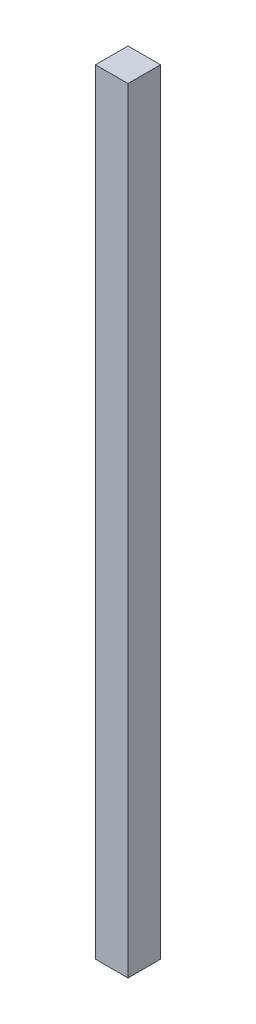
ISO-10303-21;
HEADER;
FILE_DESCRIPTION(('STEP AP214'),'2;1');
FILE_NAME('part.step','',(''),(''),'','','');
FILE_SCHEMA(('AUTOMOTIVE_DESIGN { 1 0 10303 214 1 1 1 1 }'));
ENDSEC;
DATA;
#1=APPLICATION_CONTEXT('core data for automotive mechanical design processes');
#2=APPLICATION_PROTOCOL_DEFINITION('international standard','automotive_design',2000,#1);
#3=PRODUCT_CONTEXT('',#1,'mechanical');
#4=PRODUCT('Part','Part','',(#3));
#5=PRODUCT_RELATED_PRODUCT_CATEGORY('part','',(#4));
#6=PRODUCT_DEFINITION_FORMATION('','',#4);
#7=PRODUCT_DEFINITION_CONTEXT('part definition',#1,'design');
#8=PRODUCT_DEFINITION('design','',#6,#7);
#9=PRODUCT_DEFINITION_SHAPE('','',#8);
#10=(LENGTH_UNIT() NAMED_UNIT(*) SI_UNIT(.MILLI.,.METRE.));
#11=(NAMED_UNIT(*) PLANE_ANGLE_UNIT() SI_UNIT($,.RADIAN.));
#12=(NAMED_UNIT(*) SI_UNIT($,.STERADIAN.) SOLID_ANGLE_UNIT());
#13=UNCERTAINTY_MEASURE_WITH_UNIT(LENGTH_MEASURE(1.E-05),#10,'distance_accuracy_value','');
#14=(GEOMETRIC_REPRESENTATION_CONTEXT(3) GLOBAL_UNCERTAINTY_ASSIGNED_CONTEXT((#13)) GLOBAL_UNIT_ASSIGNED_CONTEXT((#10,
#11,#12)) REPRESENTATION_CONTEXT('',''));
#15=CARTESIAN_POINT('',(0.,0.,0.));
#16=DIRECTION('',(0.,0.,1.));
#17=DIRECTION('',(1.,0.,0.));
#18=AXIS2_PLACEMENT_3D('',#15,#16,#17);
#19=CARTESIAN_POINT('',(5.244044241,250.,-5.24404424));
#20=DIRECTION('',(-1.,0.,0.));
#21=DIRECTION('',(0.,0.,1.));
#22=AXIS2_PLACEMENT_3D('',#19,#20,#21);
#23=PLANE('',#22);
#24=DIRECTION('',(0.,0.,-1.));
#25=VECTOR('',#24,1.);
#26=CARTESIAN_POINT('',(5.244044241,0.,-5.24404424));
#27=LINE('',#26,#25);
#28=CARTESIAN_POINT('',(5.244044241,0.,5.24404424));
#29=VERTEX_POINT('',#28);
#30=CARTESIAN_POINT('',(5.244044241,0.,-5.24404424));
#31=VERTEX_POINT('',#30);
#32=EDGE_CURVE('E113',#29,#31,#27,.T.);
#33=ORIENTED_EDGE('',*,*,#32,.T.);
#34=DIRECTION('',(0.,-1.,0.));
#35=VECTOR('',#34,1.);
#36=CARTESIAN_POINT('',(5.244044241,250.,-5.24404424));
#37=LINE('',#36,#35);
#38=CARTESIAN_POINT('',(5.244044241,250.,-5.24404424));
#39=VERTEX_POINT('',#38);
#40=EDGE_CURVE('E11',#39,#31,#37,.T.);
#41=ORIENTED_EDGE('',*,*,#40,.F.);
#42=DIRECTION('',(0.,0.,-1.));
#43=VECTOR('',#42,1.);
#44=CARTESIAN_POINT('',(5.244044241,250.,-5.24404424));
#45=LINE('',#44,#43);
#46=CARTESIAN_POINT('',(5.244044241,250.,5.24404424));
#47=VERTEX_POINT('',#46);
#48=EDGE_CURVE('E97',#47,#39,#45,.T.);
#49=ORIENTED_EDGE('',*,*,#48,.F.);
#50=DIRECTION('',(0.,-1.,0.));
#51=VECTOR('',#50,1.);
#52=CARTESIAN_POINT('',(5.244044241,250.,5.24404424));
#53=LINE('',#52,#51);
#54=EDGE_CURVE('E109',#47,#29,#53,.T.);
#55=ORIENTED_EDGE('',*,*,#54,.T.);
#56=EDGE_LOOP('',(#33,#41,#49,#55));
#57=FACE_BOUND('',#56,.T.);
#58=ADVANCED_FACE('F45',(#57),#23,.F.);
#59=CARTESIAN_POINT('',(-5.244044241,250.,-5.24404424));
#60=DIRECTION('',(0.,0.,1.));
#61=DIRECTION('',(1.,0.,0.));
#62=AXIS2_PLACEMENT_3D('',#59,#60,#61);
#63=PLANE('',#62);
#64=DIRECTION('',(-1.,0.,0.));
#65=VECTOR('',#64,1.);
#66=CARTESIAN_POINT('',(-5.244044241,0.,-5.24404424));
#67=LINE('',#66,#65);
#68=CARTESIAN_POINT('',(-5.244044241,0.,-5.24404424));
#69=VERTEX_POINT('',#68);
#70=EDGE_CURVE('E102',#31,#69,#67,.T.);
#71=ORIENTED_EDGE('',*,*,#70,.T.);
#72=DIRECTION('',(0.,-1.,0.));
#73=VECTOR('',#72,1.);
#74=CARTESIAN_POINT('',(-5.244044241,250.,-5.24404424));
#75=LINE('',#74,#73);
#76=CARTESIAN_POINT('',(-5.244044241,250.,-5.24404424));
#77=VERTEX_POINT('',#76);
#78=EDGE_CURVE('E54',#77,#69,#75,.T.);
#79=ORIENTED_EDGE('',*,*,#78,.F.);
#80=DIRECTION('',(-1.,0.,0.));
#81=VECTOR('',#80,1.);
#82=CARTESIAN_POINT('',(-5.244044241,250.,-5.24404424));
#83=LINE('',#82,#81);
#84=EDGE_CURVE('E92',#39,#77,#83,.T.);
#85=ORIENTED_EDGE('',*,*,#84,.F.);
#86=ORIENTED_EDGE('',*,*,#40,.T.);
#87=EDGE_LOOP('',(#71,#79,#85,#86));
#88=FACE_BOUND('',#87,.T.);
#89=ADVANCED_FACE('F101',(#88),#63,.F.);
#90=CARTESIAN_POINT('',(-5.244044241,250.,-5.24404424));
#91=DIRECTION('',(1.,0.,0.));
#92=DIRECTION('',(0.,0.,-1.));
#93=AXIS2_PLACEMENT_3D('',#90,#91,#92);
#94=PLANE('',#93);
#95=DIRECTION('',(0.,0.,1.));
#96=VECTOR('',#95,1.);
#97=CARTESIAN_POINT('',(-5.244044241,0.,-5.24404424));
#98=LINE('',#97,#96);
#99=CARTESIAN_POINT('',(-5.244044241,0.,5.24404424));
#100=VERTEX_POINT('',#99);
#101=EDGE_CURVE('E79',#69,#100,#98,.T.);
#102=ORIENTED_EDGE('',*,*,#101,.T.);
#103=DIRECTION('',(0.,-1.,0.));
#104=VECTOR('',#103,1.);
#105=CARTESIAN_POINT('',(-5.244044241,250.,5.24404424));
#106=LINE('',#105,#104);
#107=CARTESIAN_POINT('',(-5.244044241,250.,5.24404424));
#108=VERTEX_POINT('',#107);
#109=EDGE_CURVE('E104',#108,#100,#106,.T.);
#110=ORIENTED_EDGE('',*,*,#109,.F.);
#111=DIRECTION('',(0.,0.,1.));
#112=VECTOR('',#111,1.);
#113=CARTESIAN_POINT('',(-5.244044241,250.,-5.24404424));
#114=LINE('',#113,#112);
#115=EDGE_CURVE('E95',#77,#108,#114,.T.);
#116=ORIENTED_EDGE('',*,*,#115,.F.);
#117=ORIENTED_EDGE('',*,*,#78,.T.);
#118=EDGE_LOOP('',(#102,#110,#116,#117));
#119=FACE_BOUND('',#118,.T.);
#120=ADVANCED_FACE('F105',(#119),#94,.F.);
#121=CARTESIAN_POINT('',(-5.244044241,250.,5.24404424));
#122=DIRECTION('',(0.,0.,-1.));
#123=DIRECTION('',(-1.,0.,0.));
#124=AXIS2_PLACEMENT_3D('',#121,#122,#123);
#125=PLANE('',#124);
#126=DIRECTION('',(1.,0.,0.));
#127=VECTOR('',#126,1.);
#128=CARTESIAN_POINT('',(-5.244044241,0.,5.24404424));
#129=LINE('',#128,#127);
#130=EDGE_CURVE('E85',#100,#29,#129,.T.);
#131=ORIENTED_EDGE('',*,*,#130,.T.);
#132=ORIENTED_EDGE('',*,*,#54,.F.);
#133=DIRECTION('',(1.,0.,0.));
#134=VECTOR('',#133,1.);
#135=CARTESIAN_POINT('',(-5.244044241,250.,5.24404424));
#136=LINE('',#135,#134);
#137=EDGE_CURVE('E62',#108,#47,#136,.T.);
#138=ORIENTED_EDGE('',*,*,#137,.F.);
#139=ORIENTED_EDGE('',*,*,#109,.T.);
#140=EDGE_LOOP('',(#131,#132,#138,#139));
#141=FACE_BOUND('',#140,.T.);
#142=ADVANCED_FACE('F126',(#141),#125,.F.);
#143=CARTESIAN_POINT('',(0.,250.,0.));
#144=DIRECTION('',(0.,1.,0.));
#145=DIRECTION('',(0.,0.,1.));
#146=AXIS2_PLACEMENT_3D('',#143,#144,#145);
#147=PLANE('',#146);
#148=ORIENTED_EDGE('',*,*,#48,.T.);
#149=ORIENTED_EDGE('',*,*,#84,.T.);
#150=ORIENTED_EDGE('',*,*,#115,.T.);
#151=ORIENTED_EDGE('',*,*,#137,.T.);
#152=EDGE_LOOP('',(#148,#149,#150,#151));
#153=FACE_BOUND('',#152,.T.);
#154=ADVANCED_FACE('F93',(#153),#147,.T.);
#155=CARTESIAN_POINT('',(0.,0.,0.));
#156=DIRECTION('',(0.,1.,0.));
#157=DIRECTION('',(0.,0.,1.));
#158=AXIS2_PLACEMENT_3D('',#155,#156,#157);
#159=PLANE('',#158);
#160=ORIENTED_EDGE('',*,*,#32,.F.);
#161=ORIENTED_EDGE('',*,*,#130,.F.);
#162=ORIENTED_EDGE('',*,*,#101,.F.);
#163=ORIENTED_EDGE('',*,*,#70,.F.);
#164=EDGE_LOOP('',(#160,#161,#162,#163));
#165=FACE_BOUND('',#164,.T.);
#166=ADVANCED_FACE('F129',(#165),#159,.F.);
#167=CLOSED_SHELL('',(#58,#89,#120,#142,#154,#166));
#168=MANIFOLD_SOLID_BREP('B2',#167);
#169=ADVANCED_BREP_SHAPE_REPRESENTATION('',(#18,#168),#14);
#170=SHAPE_DEFINITION_REPRESENTATION(#9,#169);
ENDSEC;
END-ISO-10303-21;
